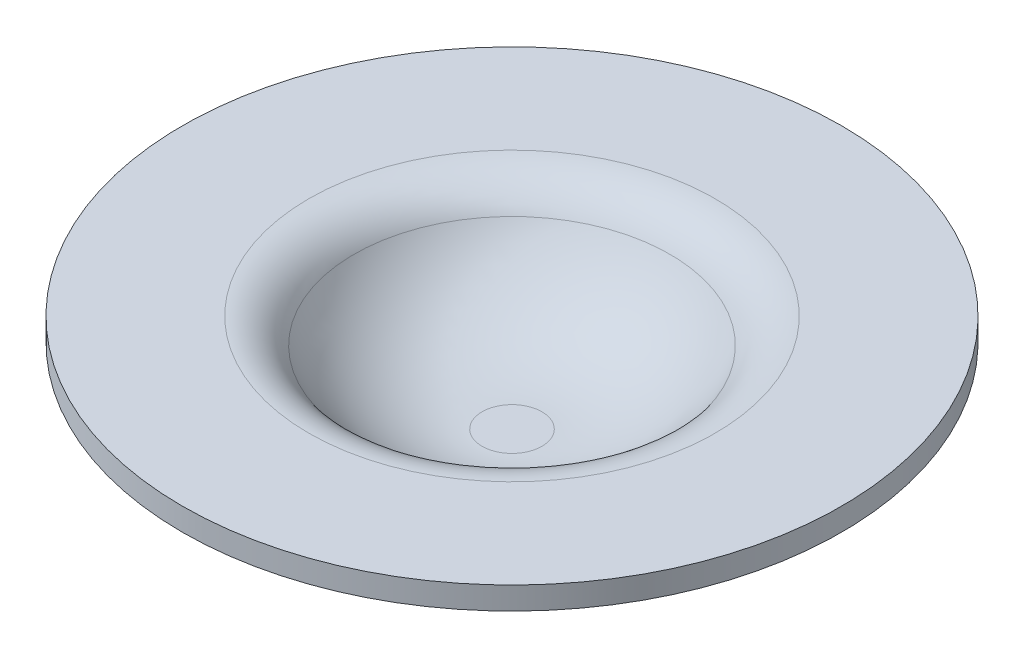
ISO-10303-21;
HEADER;
FILE_DESCRIPTION(('STEP AP214'),'2;1');
FILE_NAME('part.step','',(''),(''),'','','');
FILE_SCHEMA(('AUTOMOTIVE_DESIGN { 1 0 10303 214 1 1 1 1 }'));
ENDSEC;
DATA;
#1=APPLICATION_CONTEXT('core data for automotive mechanical design processes');
#2=APPLICATION_PROTOCOL_DEFINITION('international standard','automotive_design',2000,#1);
#3=PRODUCT_CONTEXT('',#1,'mechanical');
#4=PRODUCT('Part','Part','',(#3));
#5=PRODUCT_RELATED_PRODUCT_CATEGORY('part','',(#4));
#6=PRODUCT_DEFINITION_FORMATION('','',#4);
#7=PRODUCT_DEFINITION_CONTEXT('part definition',#1,'design');
#8=PRODUCT_DEFINITION('design','',#6,#7);
#9=PRODUCT_DEFINITION_SHAPE('','',#8);
#10=(LENGTH_UNIT() NAMED_UNIT(*) SI_UNIT(.MILLI.,.METRE.));
#11=(NAMED_UNIT(*) PLANE_ANGLE_UNIT() SI_UNIT($,.RADIAN.));
#12=(NAMED_UNIT(*) SI_UNIT($,.STERADIAN.) SOLID_ANGLE_UNIT());
#13=UNCERTAINTY_MEASURE_WITH_UNIT(LENGTH_MEASURE(1.E-05),#10,'distance_accuracy_value','');
#14=(GEOMETRIC_REPRESENTATION_CONTEXT(3) GLOBAL_UNCERTAINTY_ASSIGNED_CONTEXT((#13)) GLOBAL_UNIT_ASSIGNED_CONTEXT((#10,
#11,#12)) REPRESENTATION_CONTEXT('',''));
#15=CARTESIAN_POINT('',(0.,0.,0.));
#16=DIRECTION('',(0.,0.,1.));
#17=DIRECTION('',(1.,0.,0.));
#18=AXIS2_PLACEMENT_3D('',#15,#16,#17);
#19=CARTESIAN_POINT('',(-5.31658493337226E-06,7.57551649995769,-6.5359329163859E-06));
#20=DIRECTION('',(0.,1.,0.));
#21=DIRECTION('',(0.,0.,1.));
#22=AXIS2_PLACEMENT_3D('',#19,#20,#21);
#23=PLANE('',#22);
#24=CARTESIAN_POINT('',(-5.31658493337226E-06,7.5755164999577,-6.5359329163859E-06));
#25=DIRECTION('',(0.,1.,0.));
#26=DIRECTION('',(0.,0.,1.));
#27=AXIS2_PLACEMENT_3D('',#24,#25,#26);
#28=CIRCLE('',#27,5.9584178010742);
#29=CARTESIAN_POINT('',(-5.31658493337226E-06,7.5755164999577,5.95841126514129));
#30=VERTEX_POINT('',#29);
#31=EDGE_CURVE('E36',#30,#30,#28,.F.);
#32=ORIENTED_EDGE('',*,*,#31,.F.);
#33=EDGE_LOOP('',(#32));
#34=FACE_BOUND('',#33,.T.);
#35=ADVANCED_FACE('F32',(#34),#23,.T.);
#36=CARTESIAN_POINT('',(-5.31658493337226E-06,37.3346559372081,-6.5359329163859E-06));
#37=DIRECTION('',(0.,1.,0.));
#38=DIRECTION('',(0.,0.,1.));
#39=AXIS2_PLACEMENT_3D('',#36,#37,#38);
#40=DEGENERATE_TOROIDAL_SURFACE('',#39,5.9584178010742,29.7591394372504,.T.);
#41=ORIENTED_EDGE('',*,*,#31,.T.);
#42=EDGE_LOOP('',(#41));
#43=FACE_BOUND('',#42,.T.);
#44=CARTESIAN_POINT('',(-5.31658493337226E-06,21.989714794754,-6.5359329163859E-06));
#45=DIRECTION('',(0.,1.,0.));
#46=DIRECTION('',(0.,0.,1.));
#47=AXIS2_PLACEMENT_3D('',#44,#45,#46);
#48=CIRCLE('',#47,31.4562444021853);
#49=CARTESIAN_POINT('',(-5.31658493337226E-06,21.989714794754,31.4562378662524));
#50=VERTEX_POINT('',#49);
#51=EDGE_CURVE('E63',#50,#50,#48,.F.);
#52=ORIENTED_EDGE('',*,*,#51,.F.);
#53=EDGE_LOOP('',(#52));
#54=FACE_BOUND('',#53,.T.);
#55=ADVANCED_FACE('F88',(#43,#54),#40,.F.);
#56=CARTESIAN_POINT('',(-5.31658493337226E-06,16.5755164999577,-6.5359329163859E-06));
#57=DIRECTION('',(0.,1.,0.));
#58=DIRECTION('',(0.,0.,1.));
#59=AXIS2_PLACEMENT_3D('',#56,#57,#58);
#60=TOROIDAL_SURFACE('',#59,40.4527135331625,10.5);
#61=CARTESIAN_POINT('',(-5.31658493337226E-06,27.0755164999577,-6.5359329163859E-06));
#62=DIRECTION('',(0.,1.,0.));
#63=DIRECTION('',(-1.,0.,0.));
#64=AXIS2_PLACEMENT_3D('',#61,#62,#63);
#65=CIRCLE('',#64,40.4527135331625);
#66=CARTESIAN_POINT('',(-40.4527188497474,27.0755164999577,-6.53593292381694E-06));
#67=VERTEX_POINT('',#66);
#68=EDGE_CURVE('E59',#67,#67,#65,.F.);
#69=ORIENTED_EDGE('',*,*,#68,.F.);
#70=EDGE_LOOP('',(#69));
#71=FACE_BOUND('',#70,.T.);
#72=ORIENTED_EDGE('',*,*,#51,.T.);
#73=EDGE_LOOP('',(#72));
#74=FACE_BOUND('',#73,.T.);
#75=ADVANCED_FACE('F77',(#71,#74),#60,.T.);
#76=CARTESIAN_POINT('',(-5.95842311765914,3.07551649995769,-6.5359329163859E-06));
#77=DIRECTION('',(0.,-1.,0.));
#78=DIRECTION('',(0.,0.,-1.));
#79=AXIS2_PLACEMENT_3D('',#76,#77,#78);
#80=PLANE('',#79);
#81=CARTESIAN_POINT('',(-5.31658493337226E-06,3.07551649995764,-6.5359329163859E-06));
#82=DIRECTION('',(0.,1.,0.));
#83=DIRECTION('',(0.,0.,1.));
#84=AXIS2_PLACEMENT_3D('',#81,#82,#83);
#85=CIRCLE('',#84,5.9584178010742);
#86=CARTESIAN_POINT('',(-5.31658493337226E-06,3.07551649995764,5.95841126514129));
#87=VERTEX_POINT('',#86);
#88=EDGE_CURVE('E57',#87,#87,#85,.F.);
#89=ORIENTED_EDGE('',*,*,#88,.T.);
#90=EDGE_LOOP('',(#89));
#91=FACE_BOUND('',#90,.T.);
#92=ADVANCED_FACE('F87',(#91),#80,.T.);
#93=CARTESIAN_POINT('',(-40.4527188497474,27.0755164999577,-6.5359329163859E-06));
#94=DIRECTION('',(0.,1.,0.));
#95=DIRECTION('',(0.,0.,1.));
#96=AXIS2_PLACEMENT_3D('',#93,#94,#95);
#97=PLANE('',#96);
#98=ORIENTED_EDGE('',*,*,#68,.T.);
#99=EDGE_LOOP('',(#98));
#100=FACE_BOUND('',#99,.T.);
#101=CARTESIAN_POINT('',(-5.31658493337226E-06,27.0755164999577,-6.5359329163859E-06));
#102=DIRECTION('',(0.,1.,0.));
#103=DIRECTION('',(0.,0.,1.));
#104=AXIS2_PLACEMENT_3D('',#101,#102,#103);
#105=CIRCLE('',#104,65.625);
#106=CARTESIAN_POINT('',(-5.31658493337226E-06,27.0755164999577,65.6249934640671));
#107=VERTEX_POINT('',#106);
#108=EDGE_CURVE('E50',#107,#107,#105,.F.);
#109=ORIENTED_EDGE('',*,*,#108,.F.);
#110=EDGE_LOOP('',(#109));
#111=FACE_BOUND('',#110,.T.);
#112=ADVANCED_FACE('F95',(#100,#111),#97,.T.);
#113=CARTESIAN_POINT('',(-5.31658493337226E-06,37.3346559372078,-6.5359329163859E-06));
#114=DIRECTION('',(0.,1.,0.));
#115=DIRECTION('',(0.,0.,1.));
#116=AXIS2_PLACEMENT_3D('',#113,#114,#115);
#117=DEGENERATE_TOROIDAL_SURFACE('',#116,5.95841780107418,34.2591394372502,.T.);
#118=ORIENTED_EDGE('',*,*,#88,.F.);
#119=EDGE_LOOP('',(#118));
#120=FACE_BOUND('',#119,.T.);
#121=CARTESIAN_POINT('',(-5.31658493337226E-06,19.6693440969841,-6.5359329163859E-06));
#122=DIRECTION('',(0.,1.,0.));
#123=DIRECTION('',(0.,0.,1.));
#124=AXIS2_PLACEMENT_3D('',#121,#122,#123);
#125=CIRCLE('',#124,35.311874029747);
#126=CARTESIAN_POINT('',(-5.31658493337226E-06,19.6693440969841,35.3118674938141));
#127=VERTEX_POINT('',#126);
#128=EDGE_CURVE('E45',#127,#127,#125,.F.);
#129=ORIENTED_EDGE('',*,*,#128,.T.);
#130=EDGE_LOOP('',(#129));
#131=FACE_BOUND('',#130,.T.);
#132=ADVANCED_FACE('F34',(#120,#131),#117,.T.);
#133=CARTESIAN_POINT('',(-5.31658493337226E-06,24.8255164999577,-6.5359329163859E-06));
#134=DIRECTION('',(0.,1.,0.));
#135=DIRECTION('',(0.,0.,1.));
#136=AXIS2_PLACEMENT_3D('',#133,#134,#135);
#137=CYLINDRICAL_SURFACE('',#136,65.625);
#138=CARTESIAN_POINT('',(-5.31658493337226E-06,22.5755164999577,-6.5359329163859E-06));
#139=DIRECTION('',(0.,1.,0.));
#140=DIRECTION('',(0.,0.,1.));
#141=AXIS2_PLACEMENT_3D('',#138,#139,#140);
#142=CIRCLE('',#141,65.625);
#143=CARTESIAN_POINT('',(-5.31658493337226E-06,22.5755164999577,65.6249934640671));
#144=VERTEX_POINT('',#143);
#145=EDGE_CURVE('E40',#144,#144,#142,.F.);
#146=ORIENTED_EDGE('',*,*,#145,.F.);
#147=EDGE_LOOP('',(#146));
#148=FACE_BOUND('',#147,.T.);
#149=ORIENTED_EDGE('',*,*,#108,.T.);
#150=EDGE_LOOP('',(#149));
#151=FACE_BOUND('',#150,.T.);
#152=ADVANCED_FACE('F104',(#148,#151),#137,.T.);
#153=CARTESIAN_POINT('',(-5.31658493337226E-06,16.5755164999577,-6.5359329163859E-06));
#154=DIRECTION('',(0.,1.,0.));
#155=DIRECTION('',(0.,0.,1.));
#156=AXIS2_PLACEMENT_3D('',#153,#154,#155);
#157=TOROIDAL_SURFACE('',#156,40.4527135331625,6.);
#158=ORIENTED_EDGE('',*,*,#128,.F.);
#159=EDGE_LOOP('',(#158));
#160=FACE_BOUND('',#159,.T.);
#161=CARTESIAN_POINT('',(-5.31658493337226E-06,22.5755164999577,-6.5359329163859E-06));
#162=DIRECTION('',(0.,-1.,0.));
#163=DIRECTION('',(-1.,0.,0.));
#164=AXIS2_PLACEMENT_3D('',#161,#162,#163);
#165=CIRCLE('',#164,40.4527135331625);
#166=CARTESIAN_POINT('',(-40.4527188497474,22.5755164999577,-6.535932933725E-06));
#167=VERTEX_POINT('',#166);
#168=EDGE_CURVE('E10',#167,#167,#165,.F.);
#169=ORIENTED_EDGE('',*,*,#168,.F.);
#170=EDGE_LOOP('',(#169));
#171=FACE_BOUND('',#170,.T.);
#172=ADVANCED_FACE('F107',(#160,#171),#157,.F.);
#173=CARTESIAN_POINT('',(-65.6250053165849,22.5755164999577,-6.5359329163859E-06));
#174=DIRECTION('',(0.,-1.,0.));
#175=DIRECTION('',(0.,0.,-1.));
#176=AXIS2_PLACEMENT_3D('',#173,#174,#175);
#177=PLANE('',#176);
#178=ORIENTED_EDGE('',*,*,#168,.T.);
#179=EDGE_LOOP('',(#178));
#180=FACE_BOUND('',#179,.T.);
#181=ORIENTED_EDGE('',*,*,#145,.T.);
#182=EDGE_LOOP('',(#181));
#183=FACE_BOUND('',#182,.T.);
#184=ADVANCED_FACE('F113',(#180,#183),#177,.T.);
#185=CLOSED_SHELL('',(#35,#55,#75,#92,#112,#132,#152,#172,#184));
#186=MANIFOLD_SOLID_BREP('B2',#185);
#187=ADVANCED_BREP_SHAPE_REPRESENTATION('',(#18,#186),#14);
#188=SHAPE_DEFINITION_REPRESENTATION(#9,#187);
ENDSEC;
END-ISO-10303-21;
